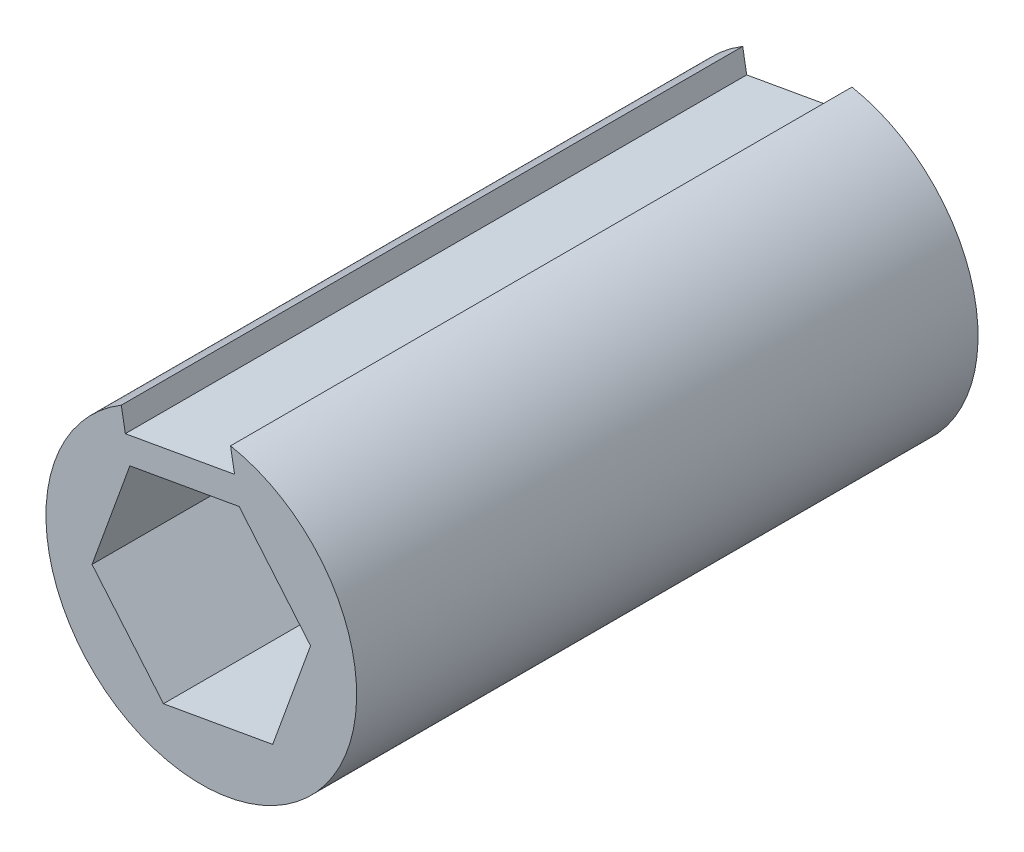
ISO-10303-21;
HEADER;
FILE_DESCRIPTION(('STEP AP214'),'2;1');
FILE_NAME('part.step','',(''),(''),'','','');
FILE_SCHEMA(('AUTOMOTIVE_DESIGN { 1 0 10303 214 1 1 1 1 }'));
ENDSEC;
DATA;
#1=APPLICATION_CONTEXT('core data for automotive mechanical design processes');
#2=APPLICATION_PROTOCOL_DEFINITION('international standard','automotive_design',2000,#1);
#3=PRODUCT_CONTEXT('',#1,'mechanical');
#4=PRODUCT('Part','Part','',(#3));
#5=PRODUCT_RELATED_PRODUCT_CATEGORY('part','',(#4));
#6=PRODUCT_DEFINITION_FORMATION('','',#4);
#7=PRODUCT_DEFINITION_CONTEXT('part definition',#1,'design');
#8=PRODUCT_DEFINITION('design','',#6,#7);
#9=PRODUCT_DEFINITION_SHAPE('','',#8);
#10=(LENGTH_UNIT() NAMED_UNIT(*) SI_UNIT(.MILLI.,.METRE.));
#11=(NAMED_UNIT(*) PLANE_ANGLE_UNIT() SI_UNIT($,.RADIAN.));
#12=(NAMED_UNIT(*) SI_UNIT($,.STERADIAN.) SOLID_ANGLE_UNIT());
#13=UNCERTAINTY_MEASURE_WITH_UNIT(LENGTH_MEASURE(1.E-05),#10,'distance_accuracy_value','');
#14=(GEOMETRIC_REPRESENTATION_CONTEXT(3) GLOBAL_UNCERTAINTY_ASSIGNED_CONTEXT((#13)) GLOBAL_UNIT_ASSIGNED_CONTEXT((#10,
#11,#12)) REPRESENTATION_CONTEXT('',''));
#15=CARTESIAN_POINT('',(0.,0.,0.));
#16=DIRECTION('',(0.,0.,1.));
#17=DIRECTION('',(1.,0.,0.));
#18=AXIS2_PLACEMENT_3D('',#15,#16,#17);
#19=CARTESIAN_POINT('',(0.,0.,28.));
#20=DIRECTION('',(0.,0.,1.));
#21=DIRECTION('',(1.,0.,0.));
#22=AXIS2_PLACEMENT_3D('',#19,#20,#21);
#23=PLANE('',#22);
#24=DIRECTION('',(0.174827422957182,-0.984599092109144,0.));
#25=VECTOR('',#24,1.);
#26=CARTESIAN_POINT('',(-3.42304855653736,4.97822644920734,28.));
#27=LINE('',#26,#25);
#28=CARTESIAN_POINT('',(-3.60458033411786,6.00058335621552,28.));
#29=VERTEX_POINT('',#28);
#30=CARTESIAN_POINT('',(-3.42304855653736,4.97822644920734,28.));
#31=VERTEX_POINT('',#30);
#32=EDGE_CURVE('E115',#29,#31,#27,.T.);
#33=ORIENTED_EDGE('',*,*,#32,.F.);
#34=CARTESIAN_POINT('',(0.,0.,28.));
#35=DIRECTION('',(0.,0.,1.));
#36=DIRECTION('',(1.,0.,0.));
#37=AXIS2_PLACEMENT_3D('',#34,#35,#36);
#38=CIRCLE('',#37,7.);
#39=CARTESIAN_POINT('',(1.31841512642786,6.87472047100144,28.));
#40=VERTEX_POINT('',#39);
#41=EDGE_CURVE('E185',#29,#40,#38,.T.);
#42=ORIENTED_EDGE('',*,*,#41,.T.);
#43=DIRECTION('',(-0.174827422957184,0.984599092109144,0.));
#44=VECTOR('',#43,1.);
#45=CARTESIAN_POINT('',(1.49994690400836,5.85236356399325,28.));
#46=LINE('',#45,#44);
#47=CARTESIAN_POINT('',(1.49994690400836,5.85236356399325,28.));
#48=VERTEX_POINT('',#47);
#49=EDGE_CURVE('E48',#48,#40,#46,.T.);
#50=ORIENTED_EDGE('',*,*,#49,.F.);
#51=DIRECTION('',(0.984599092109144,0.174827422957183,0.));
#52=VECTOR('',#51,1.);
#53=CARTESIAN_POINT('',(-3.42304855653736,4.97822644920734,28.));
#54=LINE('',#53,#52);
#55=EDGE_CURVE('E135',#31,#48,#54,.T.);
#56=ORIENTED_EDGE('',*,*,#55,.F.);
#57=EDGE_LOOP('',(#33,#42,#50,#56));
#58=FACE_BOUND('',#57,.T.);
#59=DIRECTION('',(-0.643704535613658,0.765274114831022,0.));
#60=VECTOR('',#59,1.);
#61=CARTESIAN_POINT('',(4.92299546054572,0.874137114785912,28.));
#62=LINE('',#61,#60);
#63=CARTESIAN_POINT('',(4.92299546054572,0.874137114785912,28.));
#64=VERTEX_POINT('',#63);
#65=CARTESIAN_POINT('',(1.70447278247743,4.70050768894102,28.));
#66=VERTEX_POINT('',#65);
#67=EDGE_CURVE('E145',#64,#66,#62,.T.);
#68=ORIENTED_EDGE('',*,*,#67,.F.);
#69=DIRECTION('',(0.340894556495485,0.940101537788204,0.));
#70=VECTOR('',#69,1.);
#71=CARTESIAN_POINT('',(3.21852267806829,-3.82637057415511,28.));
#72=LINE('',#71,#70);
#73=CARTESIAN_POINT('',(3.21852267806829,-3.82637057415511,28.));
#74=VERTEX_POINT('',#73);
#75=EDGE_CURVE('E143',#74,#64,#72,.T.);
#76=ORIENTED_EDGE('',*,*,#75,.F.);
#77=DIRECTION('',(0.984599092109144,0.174827422957182,0.));
#78=VECTOR('',#77,1.);
#79=CARTESIAN_POINT('',(-1.70447278247743,-4.70050768894102,28.));
#80=LINE('',#79,#78);
#81=CARTESIAN_POINT('',(-1.70447278247743,-4.70050768894102,28.));
#82=VERTEX_POINT('',#81);
#83=EDGE_CURVE('E154',#82,#74,#80,.T.);
#84=ORIENTED_EDGE('',*,*,#83,.F.);
#85=DIRECTION('',(0.643704535613658,-0.765274114831022,0.));
#86=VECTOR('',#85,1.);
#87=CARTESIAN_POINT('',(-4.92299546054572,-0.874137114785912,28.));
#88=LINE('',#87,#86);
#89=CARTESIAN_POINT('',(-4.92299546054572,-0.874137114785912,28.));
#90=VERTEX_POINT('',#89);
#91=EDGE_CURVE('E152',#90,#82,#88,.T.);
#92=ORIENTED_EDGE('',*,*,#91,.F.);
#93=DIRECTION('',(-0.340894556495485,-0.940101537788204,0.));
#94=VECTOR('',#93,1.);
#95=CARTESIAN_POINT('',(-3.21852267806829,3.82637057415511,28.));
#96=LINE('',#95,#94);
#97=CARTESIAN_POINT('',(-3.21852267806829,3.82637057415511,28.));
#98=VERTEX_POINT('',#97);
#99=EDGE_CURVE('E150',#98,#90,#96,.T.);
#100=ORIENTED_EDGE('',*,*,#99,.F.);
#101=DIRECTION('',(-0.984599092109144,-0.174827422957182,0.));
#102=VECTOR('',#101,1.);
#103=CARTESIAN_POINT('',(1.70447278247743,4.70050768894102,28.));
#104=LINE('',#103,#102);
#105=EDGE_CURVE('E148',#66,#98,#104,.T.);
#106=ORIENTED_EDGE('',*,*,#105,.F.);
#107=EDGE_LOOP('',(#68,#76,#84,#92,#100,#106));
#108=FACE_BOUND('',#107,.T.);
#109=ADVANCED_FACE('F33',(#58,#108),#23,.T.);
#110=CARTESIAN_POINT('',(0.,0.,0.));
#111=DIRECTION('',(0.,0.,1.));
#112=DIRECTION('',(1.,0.,0.));
#113=AXIS2_PLACEMENT_3D('',#110,#111,#112);
#114=PLANE('',#113);
#115=CARTESIAN_POINT('',(0.,0.,0.));
#116=DIRECTION('',(0.,0.,1.));
#117=DIRECTION('',(1.,0.,0.));
#118=AXIS2_PLACEMENT_3D('',#115,#116,#117);
#119=CIRCLE('',#118,7.);
#120=CARTESIAN_POINT('',(-3.60458033411786,6.00058335621552,0.));
#121=VERTEX_POINT('',#120);
#122=CARTESIAN_POINT('',(1.31841512642786,6.87472047100144,0.));
#123=VERTEX_POINT('',#122);
#124=EDGE_CURVE('E133',#121,#123,#119,.T.);
#125=ORIENTED_EDGE('',*,*,#124,.F.);
#126=DIRECTION('',(0.174827422957182,-0.984599092109144,0.));
#127=VECTOR('',#126,1.);
#128=CARTESIAN_POINT('',(-3.42304855653736,4.97822644920734,0.));
#129=LINE('',#128,#127);
#130=CARTESIAN_POINT('',(-3.42304855653736,4.97822644920734,0.));
#131=VERTEX_POINT('',#130);
#132=EDGE_CURVE('E113',#121,#131,#129,.T.);
#133=ORIENTED_EDGE('',*,*,#132,.T.);
#134=DIRECTION('',(0.984599092109144,0.174827422957183,0.));
#135=VECTOR('',#134,1.);
#136=CARTESIAN_POINT('',(-3.42304855653736,4.97822644920734,0.));
#137=LINE('',#136,#135);
#138=CARTESIAN_POINT('',(1.49994690400836,5.85236356399325,0.));
#139=VERTEX_POINT('',#138);
#140=EDGE_CURVE('E123',#131,#139,#137,.T.);
#141=ORIENTED_EDGE('',*,*,#140,.T.);
#142=DIRECTION('',(-0.174827422957184,0.984599092109144,0.));
#143=VECTOR('',#142,1.);
#144=CARTESIAN_POINT('',(1.49994690400836,5.85236356399325,0.));
#145=LINE('',#144,#143);
#146=EDGE_CURVE('E120',#139,#123,#145,.T.);
#147=ORIENTED_EDGE('',*,*,#146,.T.);
#148=EDGE_LOOP('',(#125,#133,#141,#147));
#149=FACE_BOUND('',#148,.T.);
#150=DIRECTION('',(0.340894556495485,0.940101537788204,0.));
#151=VECTOR('',#150,1.);
#152=CARTESIAN_POINT('',(3.21852267806829,-3.82637057415511,0.));
#153=LINE('',#152,#151);
#154=CARTESIAN_POINT('',(3.21852267806829,-3.82637057415511,0.));
#155=VERTEX_POINT('',#154);
#156=CARTESIAN_POINT('',(4.92299546054572,0.874137114785912,0.));
#157=VERTEX_POINT('',#156);
#158=EDGE_CURVE('E141',#155,#157,#153,.T.);
#159=ORIENTED_EDGE('',*,*,#158,.T.);
#160=DIRECTION('',(-0.643704535613658,0.765274114831022,0.));
#161=VECTOR('',#160,1.);
#162=CARTESIAN_POINT('',(4.92299546054572,0.874137114785912,0.));
#163=LINE('',#162,#161);
#164=CARTESIAN_POINT('',(1.70447278247743,4.70050768894102,0.));
#165=VERTEX_POINT('',#164);
#166=EDGE_CURVE('E159',#157,#165,#163,.T.);
#167=ORIENTED_EDGE('',*,*,#166,.T.);
#168=DIRECTION('',(-0.984599092109144,-0.174827422957182,0.));
#169=VECTOR('',#168,1.);
#170=CARTESIAN_POINT('',(1.70447278247743,4.70050768894102,0.));
#171=LINE('',#170,#169);
#172=CARTESIAN_POINT('',(-3.21852267806829,3.82637057415511,0.));
#173=VERTEX_POINT('',#172);
#174=EDGE_CURVE('E162',#165,#173,#171,.T.);
#175=ORIENTED_EDGE('',*,*,#174,.T.);
#176=DIRECTION('',(-0.340894556495485,-0.940101537788204,0.));
#177=VECTOR('',#176,1.);
#178=CARTESIAN_POINT('',(-3.21852267806829,3.82637057415511,0.));
#179=LINE('',#178,#177);
#180=CARTESIAN_POINT('',(-4.92299546054572,-0.874137114785912,0.));
#181=VERTEX_POINT('',#180);
#182=EDGE_CURVE('E165',#173,#181,#179,.T.);
#183=ORIENTED_EDGE('',*,*,#182,.T.);
#184=DIRECTION('',(0.643704535613658,-0.765274114831022,0.));
#185=VECTOR('',#184,1.);
#186=CARTESIAN_POINT('',(-4.92299546054572,-0.874137114785912,0.));
#187=LINE('',#186,#185);
#188=CARTESIAN_POINT('',(-1.70447278247743,-4.70050768894102,0.));
#189=VERTEX_POINT('',#188);
#190=EDGE_CURVE('E168',#181,#189,#187,.T.);
#191=ORIENTED_EDGE('',*,*,#190,.T.);
#192=DIRECTION('',(0.984599092109144,0.174827422957182,0.));
#193=VECTOR('',#192,1.);
#194=CARTESIAN_POINT('',(-1.70447278247743,-4.70050768894102,0.));
#195=LINE('',#194,#193);
#196=EDGE_CURVE('E146',#189,#155,#195,.T.);
#197=ORIENTED_EDGE('',*,*,#196,.T.);
#198=EDGE_LOOP('',(#159,#167,#175,#183,#191,#197));
#199=FACE_BOUND('',#198,.T.);
#200=ADVANCED_FACE('F130',(#149,#199),#114,.F.);
#201=CARTESIAN_POINT('',(0.,0.,28.));
#202=DIRECTION('',(0.,0.,-1.));
#203=DIRECTION('',(-1.,0.,0.));
#204=AXIS2_PLACEMENT_3D('',#201,#202,#203);
#205=CYLINDRICAL_SURFACE('',#204,7.);
#206=ORIENTED_EDGE('',*,*,#41,.F.);
#207=DIRECTION('',(0.,0.,-1.));
#208=VECTOR('',#207,1.);
#209=CARTESIAN_POINT('',(-3.60458033411786,6.00058335621552,28.));
#210=LINE('',#209,#208);
#211=EDGE_CURVE('E11',#29,#121,#210,.T.);
#212=ORIENTED_EDGE('',*,*,#211,.T.);
#213=ORIENTED_EDGE('',*,*,#124,.T.);
#214=DIRECTION('',(0.,0.,-1.));
#215=VECTOR('',#214,1.);
#216=CARTESIAN_POINT('',(1.31841512642786,6.87472047100144,28.));
#217=LINE('',#216,#215);
#218=EDGE_CURVE('E41',#123,#40,#217,.F.);
#219=ORIENTED_EDGE('',*,*,#218,.T.);
#220=EDGE_LOOP('',(#206,#212,#213,#219));
#221=FACE_BOUND('',#220,.T.);
#222=ADVANCED_FACE('F35',(#221),#205,.T.);
#223=CARTESIAN_POINT('',(3.21852267806829,-3.82637057415511,28.));
#224=DIRECTION('',(-0.940101537788204,0.340894556495485,0.));
#225=DIRECTION('',(-0.340894556495485,-0.940101537788204,0.));
#226=AXIS2_PLACEMENT_3D('',#223,#224,#225);
#227=PLANE('',#226);
#228=ORIENTED_EDGE('',*,*,#158,.F.);
#229=DIRECTION('',(0.,0.,-1.));
#230=VECTOR('',#229,1.);
#231=CARTESIAN_POINT('',(3.21852267806829,-3.82637057415511,28.));
#232=LINE('',#231,#230);
#233=EDGE_CURVE('E156',#74,#155,#232,.T.);
#234=ORIENTED_EDGE('',*,*,#233,.F.);
#235=ORIENTED_EDGE('',*,*,#75,.T.);
#236=DIRECTION('',(0.,0.,-1.));
#237=VECTOR('',#236,1.);
#238=CARTESIAN_POINT('',(4.92299546054572,0.874137114785912,28.));
#239=LINE('',#238,#237);
#240=EDGE_CURVE('E182',#64,#157,#239,.T.);
#241=ORIENTED_EDGE('',*,*,#240,.T.);
#242=EDGE_LOOP('',(#228,#234,#235,#241));
#243=FACE_BOUND('',#242,.T.);
#244=ADVANCED_FACE('F209',(#243),#227,.T.);
#245=CARTESIAN_POINT('',(4.92299546054572,0.874137114785912,28.));
#246=DIRECTION('',(-0.765274114831022,-0.643704535613658,0.));
#247=DIRECTION('',(0.643704535613658,-0.765274114831022,0.));
#248=AXIS2_PLACEMENT_3D('',#245,#246,#247);
#249=PLANE('',#248);
#250=ORIENTED_EDGE('',*,*,#166,.F.);
#251=ORIENTED_EDGE('',*,*,#240,.F.);
#252=ORIENTED_EDGE('',*,*,#67,.T.);
#253=DIRECTION('',(0.,0.,-1.));
#254=VECTOR('',#253,1.);
#255=CARTESIAN_POINT('',(1.70447278247743,4.70050768894102,28.));
#256=LINE('',#255,#254);
#257=EDGE_CURVE('E180',#66,#165,#256,.T.);
#258=ORIENTED_EDGE('',*,*,#257,.T.);
#259=EDGE_LOOP('',(#250,#251,#252,#258));
#260=FACE_BOUND('',#259,.T.);
#261=ADVANCED_FACE('F202',(#260),#249,.T.);
#262=CARTESIAN_POINT('',(1.70447278247743,4.70050768894102,28.));
#263=DIRECTION('',(0.174827422957182,-0.984599092109144,0.));
#264=DIRECTION('',(0.984599092109144,0.174827422957182,0.));
#265=AXIS2_PLACEMENT_3D('',#262,#263,#264);
#266=PLANE('',#265);
#267=ORIENTED_EDGE('',*,*,#174,.F.);
#268=ORIENTED_EDGE('',*,*,#257,.F.);
#269=ORIENTED_EDGE('',*,*,#105,.T.);
#270=DIRECTION('',(0.,0.,-1.));
#271=VECTOR('',#270,1.);
#272=CARTESIAN_POINT('',(-3.21852267806829,3.82637057415511,28.));
#273=LINE('',#272,#271);
#274=EDGE_CURVE('E178',#98,#173,#273,.T.);
#275=ORIENTED_EDGE('',*,*,#274,.T.);
#276=EDGE_LOOP('',(#267,#268,#269,#275));
#277=FACE_BOUND('',#276,.T.);
#278=ADVANCED_FACE('F205',(#277),#266,.T.);
#279=CARTESIAN_POINT('',(-3.21852267806829,3.82637057415511,28.));
#280=DIRECTION('',(0.940101537788204,-0.340894556495485,0.));
#281=DIRECTION('',(0.340894556495485,0.940101537788204,0.));
#282=AXIS2_PLACEMENT_3D('',#279,#280,#281);
#283=PLANE('',#282);
#284=ORIENTED_EDGE('',*,*,#182,.F.);
#285=ORIENTED_EDGE('',*,*,#274,.F.);
#286=ORIENTED_EDGE('',*,*,#99,.T.);
#287=DIRECTION('',(0.,0.,-1.));
#288=VECTOR('',#287,1.);
#289=CARTESIAN_POINT('',(-4.92299546054572,-0.874137114785912,28.));
#290=LINE('',#289,#288);
#291=EDGE_CURVE('E176',#90,#181,#290,.T.);
#292=ORIENTED_EDGE('',*,*,#291,.T.);
#293=EDGE_LOOP('',(#284,#285,#286,#292));
#294=FACE_BOUND('',#293,.T.);
#295=ADVANCED_FACE('F218',(#294),#283,.T.);
#296=CARTESIAN_POINT('',(-4.92299546054572,-0.874137114785912,28.));
#297=DIRECTION('',(0.765274114831022,0.643704535613658,0.));
#298=DIRECTION('',(-0.643704535613658,0.765274114831022,0.));
#299=AXIS2_PLACEMENT_3D('',#296,#297,#298);
#300=PLANE('',#299);
#301=ORIENTED_EDGE('',*,*,#190,.F.);
#302=ORIENTED_EDGE('',*,*,#291,.F.);
#303=ORIENTED_EDGE('',*,*,#91,.T.);
#304=DIRECTION('',(0.,0.,-1.));
#305=VECTOR('',#304,1.);
#306=CARTESIAN_POINT('',(-1.70447278247743,-4.70050768894102,28.));
#307=LINE('',#306,#305);
#308=EDGE_CURVE('E56',#82,#189,#307,.T.);
#309=ORIENTED_EDGE('',*,*,#308,.T.);
#310=EDGE_LOOP('',(#301,#302,#303,#309));
#311=FACE_BOUND('',#310,.T.);
#312=ADVANCED_FACE('F215',(#311),#300,.T.);
#313=CARTESIAN_POINT('',(-1.70447278247743,-4.70050768894102,28.));
#314=DIRECTION('',(-0.174827422957182,0.984599092109144,0.));
#315=DIRECTION('',(-0.984599092109144,-0.174827422957182,0.));
#316=AXIS2_PLACEMENT_3D('',#313,#314,#315);
#317=PLANE('',#316);
#318=ORIENTED_EDGE('',*,*,#196,.F.);
#319=ORIENTED_EDGE('',*,*,#308,.F.);
#320=ORIENTED_EDGE('',*,*,#83,.T.);
#321=ORIENTED_EDGE('',*,*,#233,.T.);
#322=EDGE_LOOP('',(#318,#319,#320,#321));
#323=FACE_BOUND('',#322,.T.);
#324=ADVANCED_FACE('F211',(#323),#317,.T.);
#325=CARTESIAN_POINT('',(-3.42304855653736,4.97822644920734,0.));
#326=DIRECTION('',(-0.984599092109144,-0.174827422957182,0.));
#327=DIRECTION('',(0.174827422957182,-0.984599092109144,0.));
#328=AXIS2_PLACEMENT_3D('',#325,#326,#327);
#329=PLANE('',#328);
#330=ORIENTED_EDGE('',*,*,#32,.T.);
#331=DIRECTION('',(0.,0.,1.));
#332=VECTOR('',#331,1.);
#333=CARTESIAN_POINT('',(-3.42304855653736,4.97822644920734,0.));
#334=LINE('',#333,#332);
#335=EDGE_CURVE('E109',#131,#31,#334,.T.);
#336=ORIENTED_EDGE('',*,*,#335,.F.);
#337=ORIENTED_EDGE('',*,*,#132,.F.);
#338=ORIENTED_EDGE('',*,*,#211,.F.);
#339=EDGE_LOOP('',(#330,#336,#337,#338));
#340=FACE_BOUND('',#339,.T.);
#341=ADVANCED_FACE('F111',(#340),#329,.F.);
#342=CARTESIAN_POINT('',(1.49994690400836,5.85236356399325,0.));
#343=DIRECTION('',(0.984599092109144,0.174827422957184,0.));
#344=DIRECTION('',(-0.174827422957184,0.984599092109144,0.));
#345=AXIS2_PLACEMENT_3D('',#342,#343,#344);
#346=PLANE('',#345);
#347=ORIENTED_EDGE('',*,*,#146,.F.);
#348=DIRECTION('',(0.,0.,1.));
#349=VECTOR('',#348,1.);
#350=CARTESIAN_POINT('',(1.49994690400836,5.85236356399325,0.));
#351=LINE('',#350,#349);
#352=EDGE_CURVE('E119',#139,#48,#351,.T.);
#353=ORIENTED_EDGE('',*,*,#352,.T.);
#354=ORIENTED_EDGE('',*,*,#49,.T.);
#355=ORIENTED_EDGE('',*,*,#218,.F.);
#356=EDGE_LOOP('',(#347,#353,#354,#355));
#357=FACE_BOUND('',#356,.T.);
#358=ADVANCED_FACE('F245',(#357),#346,.F.);
#359=CARTESIAN_POINT('',(-3.42304855653736,4.97822644920734,0.));
#360=DIRECTION('',(0.174827422957183,-0.984599092109144,0.));
#361=DIRECTION('',(0.984599092109144,0.174827422957183,0.));
#362=AXIS2_PLACEMENT_3D('',#359,#360,#361);
#363=PLANE('',#362);
#364=ORIENTED_EDGE('',*,*,#55,.T.);
#365=ORIENTED_EDGE('',*,*,#352,.F.);
#366=ORIENTED_EDGE('',*,*,#140,.F.);
#367=ORIENTED_EDGE('',*,*,#335,.T.);
#368=EDGE_LOOP('',(#364,#365,#366,#367));
#369=FACE_BOUND('',#368,.T.);
#370=ADVANCED_FACE('F124',(#369),#363,.F.);
#371=CLOSED_SHELL('',(#109,#200,#222,#244,#261,#278,#295,#312,#324,#341,#358,#370));
#372=MANIFOLD_SOLID_BREP('B2',#371);
#373=ADVANCED_BREP_SHAPE_REPRESENTATION('',(#18,#372),#14);
#374=SHAPE_DEFINITION_REPRESENTATION(#9,#373);
ENDSEC;
END-ISO-10303-21;
